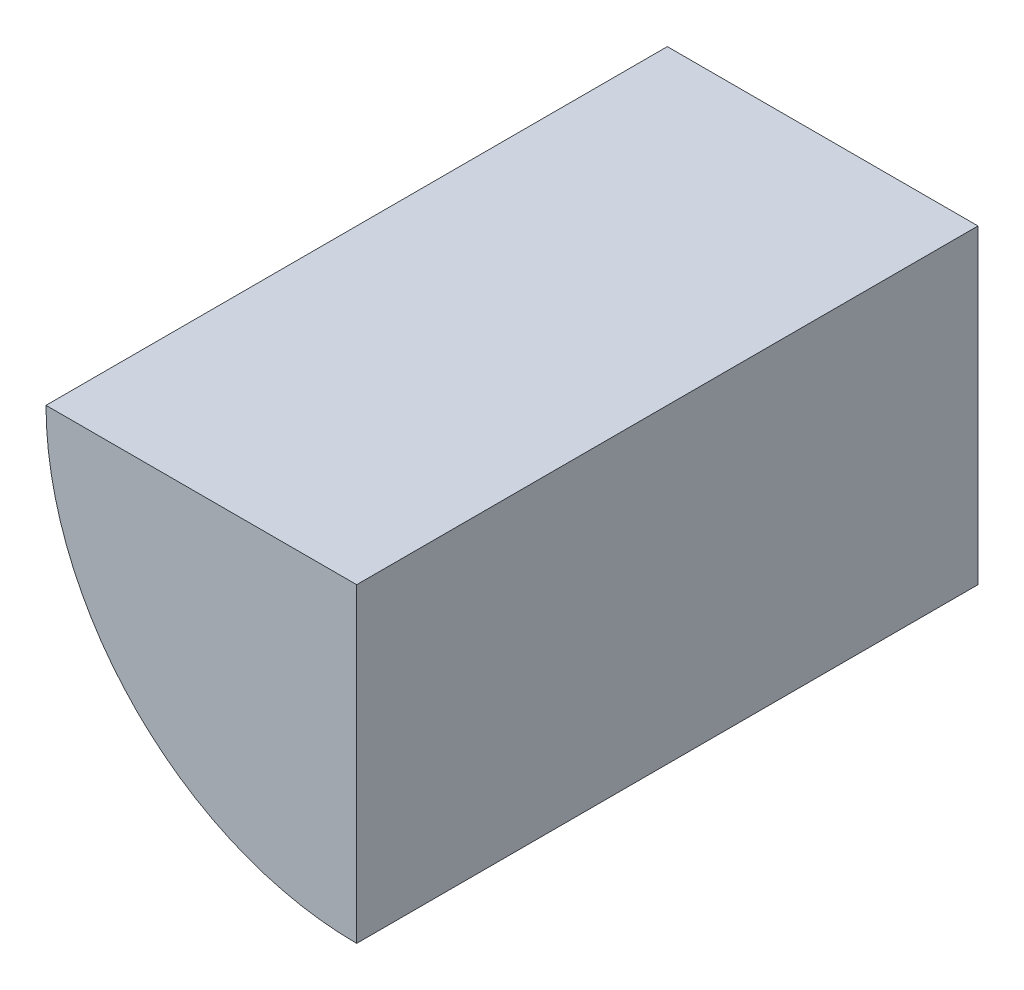
ISO-10303-21;
HEADER;
FILE_DESCRIPTION(('STEP AP214'),'2;1');
FILE_NAME('part.step','',(''),(''),'','','');
FILE_SCHEMA(('AUTOMOTIVE_DESIGN { 1 0 10303 214 1 1 1 1 }'));
ENDSEC;
DATA;
#1=APPLICATION_CONTEXT('core data for automotive mechanical design processes');
#2=APPLICATION_PROTOCOL_DEFINITION('international standard','automotive_design',2000,#1);
#3=PRODUCT_CONTEXT('',#1,'mechanical');
#4=PRODUCT('Part','Part','',(#3));
#5=PRODUCT_RELATED_PRODUCT_CATEGORY('part','',(#4));
#6=PRODUCT_DEFINITION_FORMATION('','',#4);
#7=PRODUCT_DEFINITION_CONTEXT('part definition',#1,'design');
#8=PRODUCT_DEFINITION('design','',#6,#7);
#9=PRODUCT_DEFINITION_SHAPE('','',#8);
#10=(LENGTH_UNIT() NAMED_UNIT(*) SI_UNIT(.MILLI.,.METRE.));
#11=(NAMED_UNIT(*) PLANE_ANGLE_UNIT() SI_UNIT($,.RADIAN.));
#12=(NAMED_UNIT(*) SI_UNIT($,.STERADIAN.) SOLID_ANGLE_UNIT());
#13=UNCERTAINTY_MEASURE_WITH_UNIT(LENGTH_MEASURE(1.E-05),#10,'distance_accuracy_value','');
#14=(GEOMETRIC_REPRESENTATION_CONTEXT(3) GLOBAL_UNCERTAINTY_ASSIGNED_CONTEXT((#13)) GLOBAL_UNIT_ASSIGNED_CONTEXT((#10,
#11,#12)) REPRESENTATION_CONTEXT('',''));
#15=CARTESIAN_POINT('',(0.,0.,0.));
#16=DIRECTION('',(0.,0.,1.));
#17=DIRECTION('',(1.,0.,0.));
#18=AXIS2_PLACEMENT_3D('',#15,#16,#17);
#19=CARTESIAN_POINT('',(-25.,0.,50.));
#20=DIRECTION('',(0.,-1.,0.));
#21=DIRECTION('',(0.,0.,-1.));
#22=AXIS2_PLACEMENT_3D('',#19,#20,#21);
#23=PLANE('',#22);
#24=DIRECTION('',(-1.,0.,0.));
#25=VECTOR('',#24,1.);
#26=CARTESIAN_POINT('',(-25.,0.,0.));
#27=LINE('',#26,#25);
#28=CARTESIAN_POINT('',(0.,0.,0.));
#29=VERTEX_POINT('',#28);
#30=CARTESIAN_POINT('',(-25.,0.,0.));
#31=VERTEX_POINT('',#30);
#32=EDGE_CURVE('E80',#29,#31,#27,.T.);
#33=ORIENTED_EDGE('',*,*,#32,.T.);
#34=DIRECTION('',(0.,0.,-1.));
#35=VECTOR('',#34,1.);
#36=CARTESIAN_POINT('',(-25.,0.,50.));
#37=LINE('',#36,#35);
#38=CARTESIAN_POINT('',(-25.,0.,50.));
#39=VERTEX_POINT('',#38);
#40=EDGE_CURVE('E11',#39,#31,#37,.T.);
#41=ORIENTED_EDGE('',*,*,#40,.F.);
#42=DIRECTION('',(-1.,0.,0.));
#43=VECTOR('',#42,1.);
#44=CARTESIAN_POINT('',(-25.,0.,50.));
#45=LINE('',#44,#43);
#46=CARTESIAN_POINT('',(0.,0.,50.));
#47=VERTEX_POINT('',#46);
#48=EDGE_CURVE('E73',#47,#39,#45,.T.);
#49=ORIENTED_EDGE('',*,*,#48,.F.);
#50=DIRECTION('',(0.,0.,-1.));
#51=VECTOR('',#50,1.);
#52=CARTESIAN_POINT('',(0.,0.,50.));
#53=LINE('',#52,#51);
#54=EDGE_CURVE('E81',#47,#29,#53,.T.);
#55=ORIENTED_EDGE('',*,*,#54,.T.);
#56=EDGE_LOOP('',(#33,#41,#49,#55));
#57=FACE_BOUND('',#56,.T.);
#58=ADVANCED_FACE('F33',(#57),#23,.F.);
#59=CARTESIAN_POINT('',(0.,0.,50.));
#60=DIRECTION('',(0.,0.,-1.));
#61=DIRECTION('',(-1.,0.,0.));
#62=AXIS2_PLACEMENT_3D('',#59,#60,#61);
#63=CYLINDRICAL_SURFACE('',#62,25.);
#64=CARTESIAN_POINT('',(0.,0.,0.));
#65=DIRECTION('',(0.,0.,1.));
#66=DIRECTION('',(1.,0.,0.));
#67=AXIS2_PLACEMENT_3D('',#64,#65,#66);
#68=CIRCLE('',#67,25.);
#69=CARTESIAN_POINT('',(0.,-25.,0.));
#70=VERTEX_POINT('',#69);
#71=EDGE_CURVE('E61',#31,#70,#68,.T.);
#72=ORIENTED_EDGE('',*,*,#71,.T.);
#73=DIRECTION('',(0.,0.,-1.));
#74=VECTOR('',#73,1.);
#75=CARTESIAN_POINT('',(0.,-25.,50.));
#76=LINE('',#75,#74);
#77=CARTESIAN_POINT('',(0.,-25.,50.));
#78=VERTEX_POINT('',#77);
#79=EDGE_CURVE('E41',#78,#70,#76,.T.);
#80=ORIENTED_EDGE('',*,*,#79,.F.);
#81=CARTESIAN_POINT('',(0.,0.,50.));
#82=DIRECTION('',(0.,0.,1.));
#83=DIRECTION('',(1.,0.,0.));
#84=AXIS2_PLACEMENT_3D('',#81,#82,#83);
#85=CIRCLE('',#84,25.);
#86=EDGE_CURVE('E69',#39,#78,#85,.T.);
#87=ORIENTED_EDGE('',*,*,#86,.F.);
#88=ORIENTED_EDGE('',*,*,#40,.T.);
#89=EDGE_LOOP('',(#72,#80,#87,#88));
#90=FACE_BOUND('',#89,.T.);
#91=ADVANCED_FACE('F70',(#90),#63,.T.);
#92=CARTESIAN_POINT('',(0.,0.,50.));
#93=DIRECTION('',(-1.,0.,0.));
#94=DIRECTION('',(0.,0.,1.));
#95=AXIS2_PLACEMENT_3D('',#92,#93,#94);
#96=PLANE('',#95);
#97=DIRECTION('',(0.,1.,0.));
#98=VECTOR('',#97,1.);
#99=CARTESIAN_POINT('',(0.,0.,0.));
#100=LINE('',#99,#98);
#101=EDGE_CURVE('E66',#70,#29,#100,.T.);
#102=ORIENTED_EDGE('',*,*,#101,.T.);
#103=ORIENTED_EDGE('',*,*,#54,.F.);
#104=DIRECTION('',(0.,1.,0.));
#105=VECTOR('',#104,1.);
#106=CARTESIAN_POINT('',(0.,0.,50.));
#107=LINE('',#106,#105);
#108=EDGE_CURVE('E49',#78,#47,#107,.T.);
#109=ORIENTED_EDGE('',*,*,#108,.F.);
#110=ORIENTED_EDGE('',*,*,#79,.T.);
#111=EDGE_LOOP('',(#102,#103,#109,#110));
#112=FACE_BOUND('',#111,.T.);
#113=ADVANCED_FACE('F92',(#112),#96,.F.);
#114=CARTESIAN_POINT('',(0.,0.,50.));
#115=DIRECTION('',(0.,0.,1.));
#116=DIRECTION('',(1.,0.,0.));
#117=AXIS2_PLACEMENT_3D('',#114,#115,#116);
#118=PLANE('',#117);
#119=ORIENTED_EDGE('',*,*,#48,.T.);
#120=ORIENTED_EDGE('',*,*,#86,.T.);
#121=ORIENTED_EDGE('',*,*,#108,.T.);
#122=EDGE_LOOP('',(#119,#120,#121));
#123=FACE_BOUND('',#122,.T.);
#124=ADVANCED_FACE('F76',(#123),#118,.T.);
#125=CARTESIAN_POINT('',(0.,0.,0.));
#126=DIRECTION('',(0.,0.,1.));
#127=DIRECTION('',(1.,0.,0.));
#128=AXIS2_PLACEMENT_3D('',#125,#126,#127);
#129=PLANE('',#128);
#130=CARTESIAN_POINT('',(-10.5644668095805,-9.66334811574537,0.));
#131=DIRECTION('',(0.,0.,-1.));
#132=DIRECTION('',(-1.,0.,0.));
#133=AXIS2_PLACEMENT_3D('',#130,#131,#132);
#134=CIRCLE('',#133,5.);
#135=CARTESIAN_POINT('',(-15.5644668095805,-9.66334811574537,0.));
#136=VERTEX_POINT('',#135);
#137=EDGE_CURVE('E87',#136,#136,#134,.T.);
#138=ORIENTED_EDGE('',*,*,#137,.F.);
#139=EDGE_LOOP('',(#138));
#140=FACE_BOUND('',#139,.T.);
#141=ORIENTED_EDGE('',*,*,#32,.F.);
#142=ORIENTED_EDGE('',*,*,#101,.F.);
#143=ORIENTED_EDGE('',*,*,#71,.F.);
#144=EDGE_LOOP('',(#141,#142,#143));
#145=FACE_BOUND('',#144,.T.);
#146=ADVANCED_FACE('F93',(#140,#145),#129,.F.);
#147=CARTESIAN_POINT('',(-10.5644668095805,-9.66334811574537,10.));
#148=DIRECTION('',(0.,0.,-1.));
#149=DIRECTION('',(-1.,0.,0.));
#150=AXIS2_PLACEMENT_3D('',#147,#148,#149);
#151=CYLINDRICAL_SURFACE('',#150,5.);
#152=CARTESIAN_POINT('',(-10.5644668095805,-9.66334811574537,10.));
#153=DIRECTION('',(0.,0.,-1.));
#154=DIRECTION('',(-1.,0.,0.));
#155=AXIS2_PLACEMENT_3D('',#152,#153,#154);
#156=CIRCLE('',#155,5.);
#157=CARTESIAN_POINT('',(-15.5644668095805,-9.66334811574537,10.));
#158=VERTEX_POINT('',#157);
#159=EDGE_CURVE('E83',#158,#158,#156,.T.);
#160=ORIENTED_EDGE('',*,*,#159,.F.);
#161=EDGE_LOOP('',(#160));
#162=FACE_BOUND('',#161,.T.);
#163=ORIENTED_EDGE('',*,*,#137,.T.);
#164=EDGE_LOOP('',(#163));
#165=FACE_BOUND('',#164,.T.);
#166=ADVANCED_FACE('F95',(#162,#165),#151,.F.);
#167=CARTESIAN_POINT('',(-10.5644668095805,-9.66334811574537,10.));
#168=DIRECTION('',(0.,0.,-1.));
#169=DIRECTION('',(-1.,0.,0.));
#170=AXIS2_PLACEMENT_3D('',#167,#168,#169);
#171=PLANE('',#170);
#172=ORIENTED_EDGE('',*,*,#159,.T.);
#173=EDGE_LOOP('',(#172));
#174=FACE_BOUND('',#173,.T.);
#175=ADVANCED_FACE('F102',(#174),#171,.T.);
#176=CLOSED_SHELL('',(#58,#91,#113,#124,#146,#166,#175));
#177=MANIFOLD_SOLID_BREP('B2',#176);
#178=ADVANCED_BREP_SHAPE_REPRESENTATION('',(#18,#177),#14);
#179=SHAPE_DEFINITION_REPRESENTATION(#9,#178);
ENDSEC;
END-ISO-10303-21;
